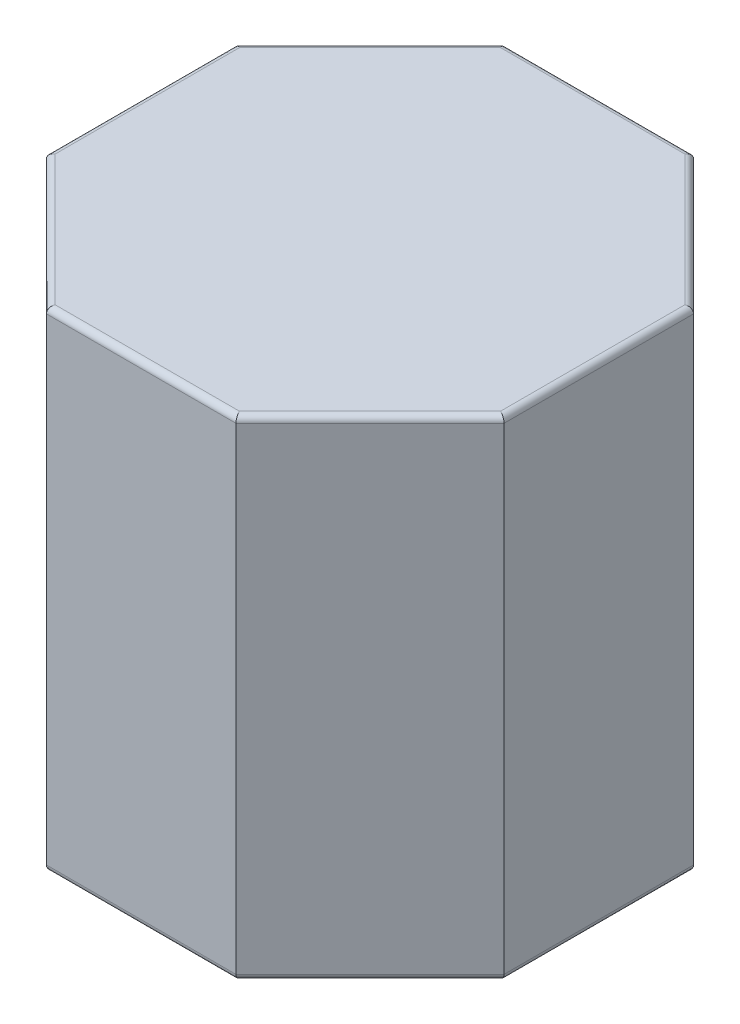
ISO-10303-21;
HEADER;
FILE_DESCRIPTION(('STEP AP214'),'2;1');
FILE_NAME('part.step','',(''),(''),'','','');
FILE_SCHEMA(('AUTOMOTIVE_DESIGN { 1 0 10303 214 1 1 1 1 }'));
ENDSEC;
DATA;
#1=APPLICATION_CONTEXT('core data for automotive mechanical design processes');
#2=APPLICATION_PROTOCOL_DEFINITION('international standard','automotive_design',2000,#1);
#3=PRODUCT_CONTEXT('',#1,'mechanical');
#4=PRODUCT('Part','Part','',(#3));
#5=PRODUCT_RELATED_PRODUCT_CATEGORY('part','',(#4));
#6=PRODUCT_DEFINITION_FORMATION('','',#4);
#7=PRODUCT_DEFINITION_CONTEXT('part definition',#1,'design');
#8=PRODUCT_DEFINITION('design','',#6,#7);
#9=PRODUCT_DEFINITION_SHAPE('','',#8);
#10=(LENGTH_UNIT() NAMED_UNIT(*) SI_UNIT(.MILLI.,.METRE.));
#11=(NAMED_UNIT(*) PLANE_ANGLE_UNIT() SI_UNIT($,.RADIAN.));
#12=(NAMED_UNIT(*) SI_UNIT($,.STERADIAN.) SOLID_ANGLE_UNIT());
#13=UNCERTAINTY_MEASURE_WITH_UNIT(LENGTH_MEASURE(1.E-05),#10,'distance_accuracy_value','');
#14=(GEOMETRIC_REPRESENTATION_CONTEXT(3) GLOBAL_UNCERTAINTY_ASSIGNED_CONTEXT((#13)) GLOBAL_UNIT_ASSIGNED_CONTEXT((#10,
#11,#12)) REPRESENTATION_CONTEXT('',''));
#15=CARTESIAN_POINT('',(0.,0.,0.));
#16=DIRECTION('',(0.,0.,1.));
#17=DIRECTION('',(1.,0.,0.));
#18=AXIS2_PLACEMENT_3D('',#15,#16,#17);
#19=CARTESIAN_POINT('',(-18.69968627595,40.,-7.74644045200017));
#20=DIRECTION('',(0.707106781186547,0.,0.707106781186548));
#21=DIRECTION('',(0.707106781186548,0.,-0.707106781186547));
#22=AXIS2_PLACEMENT_3D('',#19,#20,#21);
#23=PLANE('',#22);
#24=DIRECTION('',(0.,-1.,0.));
#25=VECTOR('',#24,1.);
#26=CARTESIAN_POINT('',(-7.74547989232688,40.,-18.7006468356233));
#27=LINE('',#26,#25);
#28=CARTESIAN_POINT('',(-7.74547989232688,39.5,-18.7006468356233));
#29=VERTEX_POINT('',#28);
#30=CARTESIAN_POINT('',(-7.74547989232688,0.5,-18.7006468356233));
#31=VERTEX_POINT('',#30);
#32=EDGE_CURVE('E241',#29,#31,#27,.T.);
#33=ORIENTED_EDGE('',*,*,#32,.T.);
#34=DIRECTION('',(-0.707106781186548,0.,0.707106781186547));
#35=VECTOR('',#34,1.);
#36=CARTESIAN_POINT('',(-18.69968627595,0.5,-7.74644045200017));
#37=LINE('',#36,#35);
#38=CARTESIAN_POINT('',(-18.69968627595,0.5,-7.74644045200017));
#39=VERTEX_POINT('',#38);
#40=EDGE_CURVE('E178',#31,#39,#37,.T.);
#41=ORIENTED_EDGE('',*,*,#40,.T.);
#42=DIRECTION('',(0.,-1.,0.));
#43=VECTOR('',#42,1.);
#44=CARTESIAN_POINT('',(-18.69968627595,40.,-7.74644045200017));
#45=LINE('',#44,#43);
#46=CARTESIAN_POINT('',(-18.69968627595,39.5,-7.74644045200017));
#47=VERTEX_POINT('',#46);
#48=EDGE_CURVE('E162',#47,#39,#45,.T.);
#49=ORIENTED_EDGE('',*,*,#48,.F.);
#50=DIRECTION('',(-0.707106781186548,0.,0.707106781186547));
#51=VECTOR('',#50,1.);
#52=CARTESIAN_POINT('',(-18.69968627595,39.5,-7.74644045200017));
#53=LINE('',#52,#51);
#54=EDGE_CURVE('E175',#47,#29,#53,.F.);
#55=ORIENTED_EDGE('',*,*,#54,.T.);
#56=EDGE_LOOP('',(#33,#41,#49,#55));
#57=FACE_BOUND('',#56,.T.);
#58=ADVANCED_FACE('F43',(#57),#23,.F.);
#59=CARTESIAN_POINT('',(-18.69968627595,40.,7.74514678075364));
#60=DIRECTION('',(1.,0.,0.));
#61=DIRECTION('',(0.,0.,-1.));
#62=AXIS2_PLACEMENT_3D('',#59,#60,#61);
#63=PLANE('',#62);
#64=ORIENTED_EDGE('',*,*,#48,.T.);
#65=DIRECTION('',(0.,0.,1.));
#66=VECTOR('',#65,1.);
#67=CARTESIAN_POINT('',(-18.69968627595,0.5,7.74514678075364));
#68=LINE('',#67,#66);
#69=CARTESIAN_POINT('',(-18.69968627595,0.5,7.74514678075364));
#70=VERTEX_POINT('',#69);
#71=EDGE_CURVE('E168',#39,#70,#68,.T.);
#72=ORIENTED_EDGE('',*,*,#71,.T.);
#73=DIRECTION('',(0.,-1.,0.));
#74=VECTOR('',#73,1.);
#75=CARTESIAN_POINT('',(-18.69968627595,40.,7.74514678075364));
#76=LINE('',#75,#74);
#77=CARTESIAN_POINT('',(-18.69968627595,39.5,7.74514678075364));
#78=VERTEX_POINT('',#77);
#79=EDGE_CURVE('E164',#78,#70,#76,.T.);
#80=ORIENTED_EDGE('',*,*,#79,.F.);
#81=DIRECTION('',(0.,0.,1.));
#82=VECTOR('',#81,1.);
#83=CARTESIAN_POINT('',(-18.69968627595,39.5,7.74514678075364));
#84=LINE('',#83,#82);
#85=EDGE_CURVE('E159',#78,#47,#84,.F.);
#86=ORIENTED_EDGE('',*,*,#85,.T.);
#87=EDGE_LOOP('',(#64,#72,#80,#86));
#88=FACE_BOUND('',#87,.T.);
#89=ADVANCED_FACE('F161',(#88),#63,.F.);
#90=CARTESIAN_POINT('',(-7.74547989232686,40.,18.6993531643768));
#91=DIRECTION('',(0.707106781186548,0.,-0.707106781186547));
#92=DIRECTION('',(-0.707106781186547,0.,-0.707106781186548));
#93=AXIS2_PLACEMENT_3D('',#90,#91,#92);
#94=PLANE('',#93);
#95=ORIENTED_EDGE('',*,*,#79,.T.);
#96=DIRECTION('',(0.707106781186547,0.,0.707106781186548));
#97=VECTOR('',#96,1.);
#98=CARTESIAN_POINT('',(-7.74547989232686,0.5,18.6993531643768));
#99=LINE('',#98,#97);
#100=CARTESIAN_POINT('',(-7.74547989232686,0.5,18.6993531643768));
#101=VERTEX_POINT('',#100);
#102=EDGE_CURVE('E285',#70,#101,#99,.T.);
#103=ORIENTED_EDGE('',*,*,#102,.T.);
#104=DIRECTION('',(0.,-1.,0.));
#105=VECTOR('',#104,1.);
#106=CARTESIAN_POINT('',(-7.74547989232686,40.,18.6993531643768));
#107=LINE('',#106,#105);
#108=CARTESIAN_POINT('',(-7.74547989232686,39.5,18.6993531643768));
#109=VERTEX_POINT('',#108);
#110=EDGE_CURVE('E261',#109,#101,#107,.T.);
#111=ORIENTED_EDGE('',*,*,#110,.F.);
#112=DIRECTION('',(0.707106781186547,0.,0.707106781186548));
#113=VECTOR('',#112,1.);
#114=CARTESIAN_POINT('',(-7.74547989232686,39.5,18.6993531643768));
#115=LINE('',#114,#113);
#116=EDGE_CURVE('E283',#109,#78,#115,.F.);
#117=ORIENTED_EDGE('',*,*,#116,.T.);
#118=EDGE_LOOP('',(#95,#103,#111,#117));
#119=FACE_BOUND('',#118,.T.);
#120=ADVANCED_FACE('F327',(#119),#94,.F.);
#121=CARTESIAN_POINT('',(7.74610734042694,40.,18.6993531643768));
#122=DIRECTION('',(0.,0.,-1.));
#123=DIRECTION('',(-1.,0.,0.));
#124=AXIS2_PLACEMENT_3D('',#121,#122,#123);
#125=PLANE('',#124);
#126=ORIENTED_EDGE('',*,*,#110,.T.);
#127=DIRECTION('',(1.,0.,0.));
#128=VECTOR('',#127,1.);
#129=CARTESIAN_POINT('',(7.74610734042694,0.5,18.6993531643768));
#130=LINE('',#129,#128);
#131=CARTESIAN_POINT('',(7.74610734042694,0.5,18.6993531643768));
#132=VERTEX_POINT('',#131);
#133=EDGE_CURVE('E289',#101,#132,#130,.T.);
#134=ORIENTED_EDGE('',*,*,#133,.T.);
#135=DIRECTION('',(0.,-1.,0.));
#136=VECTOR('',#135,1.);
#137=CARTESIAN_POINT('',(7.74610734042694,40.,18.6993531643768));
#138=LINE('',#137,#136);
#139=CARTESIAN_POINT('',(7.74610734042694,39.5,18.6993531643768));
#140=VERTEX_POINT('',#139);
#141=EDGE_CURVE('E258',#140,#132,#138,.T.);
#142=ORIENTED_EDGE('',*,*,#141,.F.);
#143=DIRECTION('',(1.,0.,0.));
#144=VECTOR('',#143,1.);
#145=CARTESIAN_POINT('',(7.74610734042694,39.5,18.6993531643768));
#146=LINE('',#145,#144);
#147=EDGE_CURVE('E287',#140,#109,#146,.F.);
#148=ORIENTED_EDGE('',*,*,#147,.T.);
#149=EDGE_LOOP('',(#126,#134,#142,#148));
#150=FACE_BOUND('',#149,.T.);
#151=ADVANCED_FACE('F330',(#150),#125,.F.);
#152=CARTESIAN_POINT('',(18.7003137240501,40.,7.74514678075363));
#153=DIRECTION('',(-0.707106781186548,0.,-0.707106781186547));
#154=DIRECTION('',(-0.707106781186547,0.,0.707106781186548));
#155=AXIS2_PLACEMENT_3D('',#152,#153,#154);
#156=PLANE('',#155);
#157=ORIENTED_EDGE('',*,*,#141,.T.);
#158=DIRECTION('',(0.707106781186547,0.,-0.707106781186548));
#159=VECTOR('',#158,1.);
#160=CARTESIAN_POINT('',(18.7003137240501,0.5,7.74514678075363));
#161=LINE('',#160,#159);
#162=CARTESIAN_POINT('',(18.7003137240501,0.5,7.74514678075363));
#163=VERTEX_POINT('',#162);
#164=EDGE_CURVE('E293',#132,#163,#161,.T.);
#165=ORIENTED_EDGE('',*,*,#164,.T.);
#166=DIRECTION('',(0.,-1.,0.));
#167=VECTOR('',#166,1.);
#168=CARTESIAN_POINT('',(18.7003137240501,40.,7.74514678075363));
#169=LINE('',#168,#167);
#170=CARTESIAN_POINT('',(18.7003137240501,39.5,7.74514678075363));
#171=VERTEX_POINT('',#170);
#172=EDGE_CURVE('E255',#171,#163,#169,.T.);
#173=ORIENTED_EDGE('',*,*,#172,.F.);
#174=DIRECTION('',(0.707106781186547,0.,-0.707106781186548));
#175=VECTOR('',#174,1.);
#176=CARTESIAN_POINT('',(18.7003137240501,39.5,7.74514678075363));
#177=LINE('',#176,#175);
#178=EDGE_CURVE('E291',#171,#140,#177,.F.);
#179=ORIENTED_EDGE('',*,*,#178,.T.);
#180=EDGE_LOOP('',(#157,#165,#173,#179));
#181=FACE_BOUND('',#180,.T.);
#182=ADVANCED_FACE('F347',(#181),#156,.F.);
#183=CARTESIAN_POINT('',(18.7003137240501,40.,-7.74644045200015));
#184=DIRECTION('',(-1.,0.,0.));
#185=DIRECTION('',(0.,0.,1.));
#186=AXIS2_PLACEMENT_3D('',#183,#184,#185);
#187=PLANE('',#186);
#188=ORIENTED_EDGE('',*,*,#172,.T.);
#189=DIRECTION('',(0.,0.,-1.));
#190=VECTOR('',#189,1.);
#191=CARTESIAN_POINT('',(18.7003137240501,0.5,-7.74644045200015));
#192=LINE('',#191,#190);
#193=CARTESIAN_POINT('',(18.7003137240501,0.5,-7.74644045200015));
#194=VERTEX_POINT('',#193);
#195=EDGE_CURVE('E297',#163,#194,#192,.T.);
#196=ORIENTED_EDGE('',*,*,#195,.T.);
#197=DIRECTION('',(0.,-1.,0.));
#198=VECTOR('',#197,1.);
#199=CARTESIAN_POINT('',(18.7003137240501,40.,-7.74644045200015));
#200=LINE('',#199,#198);
#201=CARTESIAN_POINT('',(18.7003137240501,39.5,-7.74644045200015));
#202=VERTEX_POINT('',#201);
#203=EDGE_CURVE('E250',#202,#194,#200,.T.);
#204=ORIENTED_EDGE('',*,*,#203,.F.);
#205=DIRECTION('',(0.,0.,-1.));
#206=VECTOR('',#205,1.);
#207=CARTESIAN_POINT('',(18.7003137240501,39.5,-7.74644045200015));
#208=LINE('',#207,#206);
#209=EDGE_CURVE('E295',#202,#171,#208,.F.);
#210=ORIENTED_EDGE('',*,*,#209,.T.);
#211=EDGE_LOOP('',(#188,#196,#204,#210));
#212=FACE_BOUND('',#211,.T.);
#213=ADVANCED_FACE('F350',(#212),#187,.F.);
#214=CARTESIAN_POINT('',(7.74610734042693,40.,-18.7006468356233));
#215=DIRECTION('',(-0.707106781186547,0.,0.707106781186548));
#216=DIRECTION('',(0.707106781186548,0.,0.707106781186547));
#217=AXIS2_PLACEMENT_3D('',#214,#215,#216);
#218=PLANE('',#217);
#219=ORIENTED_EDGE('',*,*,#203,.T.);
#220=DIRECTION('',(-0.707106781186548,0.,-0.707106781186547));
#221=VECTOR('',#220,1.);
#222=CARTESIAN_POINT('',(7.74610734042693,0.5,-18.7006468356233));
#223=LINE('',#222,#221);
#224=CARTESIAN_POINT('',(7.74610734042693,0.5,-18.7006468356233));
#225=VERTEX_POINT('',#224);
#226=EDGE_CURVE('E301',#194,#225,#223,.T.);
#227=ORIENTED_EDGE('',*,*,#226,.T.);
#228=DIRECTION('',(0.,-1.,0.));
#229=VECTOR('',#228,1.);
#230=CARTESIAN_POINT('',(7.74610734042693,40.,-18.7006468356233));
#231=LINE('',#230,#229);
#232=CARTESIAN_POINT('',(7.74610734042693,39.5,-18.7006468356233));
#233=VERTEX_POINT('',#232);
#234=EDGE_CURVE('E246',#233,#225,#231,.T.);
#235=ORIENTED_EDGE('',*,*,#234,.F.);
#236=DIRECTION('',(-0.707106781186548,0.,-0.707106781186547));
#237=VECTOR('',#236,1.);
#238=CARTESIAN_POINT('',(7.74610734042693,39.5,-18.7006468356233));
#239=LINE('',#238,#237);
#240=EDGE_CURVE('E299',#233,#202,#239,.F.);
#241=ORIENTED_EDGE('',*,*,#240,.T.);
#242=EDGE_LOOP('',(#219,#227,#235,#241));
#243=FACE_BOUND('',#242,.T.);
#244=ADVANCED_FACE('F516',(#243),#218,.F.);
#245=CARTESIAN_POINT('',(-7.74547989232688,40.,-18.7006468356233));
#246=DIRECTION('',(0.,0.,1.));
#247=DIRECTION('',(1.,0.,0.));
#248=AXIS2_PLACEMENT_3D('',#245,#246,#247);
#249=PLANE('',#248);
#250=ORIENTED_EDGE('',*,*,#234,.T.);
#251=DIRECTION('',(-1.,0.,0.));
#252=VECTOR('',#251,1.);
#253=CARTESIAN_POINT('',(-7.74547989232688,0.5,-18.7006468356233));
#254=LINE('',#253,#252);
#255=EDGE_CURVE('E305',#225,#31,#254,.T.);
#256=ORIENTED_EDGE('',*,*,#255,.T.);
#257=ORIENTED_EDGE('',*,*,#32,.F.);
#258=DIRECTION('',(-1.,0.,0.));
#259=VECTOR('',#258,1.);
#260=CARTESIAN_POINT('',(-7.74547989232688,39.5,-18.7006468356233));
#261=LINE('',#260,#259);
#262=EDGE_CURVE('E303',#29,#233,#261,.F.);
#263=ORIENTED_EDGE('',*,*,#262,.T.);
#264=EDGE_LOOP('',(#250,#256,#257,#263));
#265=FACE_BOUND('',#264,.T.);
#266=ADVANCED_FACE('F508',(#265),#249,.F.);
#267=CARTESIAN_POINT('',(0.,40.,0.));
#268=DIRECTION('',(0.,-1.,0.));
#269=DIRECTION('',(0.,0.,-1.));
#270=AXIS2_PLACEMENT_3D('',#267,#268,#269);
#271=PLANE('',#270);
#272=DIRECTION('',(-1.,0.,0.));
#273=VECTOR('',#272,1.);
#274=CARTESIAN_POINT('',(0.,40.,-18.2006468356233));
#275=LINE('',#274,#273);
#276=CARTESIAN_POINT('',(7.53900055924038,40.,-18.2006468356233));
#277=VERTEX_POINT('',#276);
#278=CARTESIAN_POINT('',(-7.53837311114033,40.,-18.2006468356233));
#279=VERTEX_POINT('',#278);
#280=EDGE_CURVE('E307',#277,#279,#275,.T.);
#281=ORIENTED_EDGE('',*,*,#280,.T.);
#282=DIRECTION('',(-0.707106781186548,0.,0.707106781186547));
#283=VECTOR('',#282,1.);
#284=CARTESIAN_POINT('',(-12.8695099733818,40.,-12.8695099733818));
#285=LINE('',#284,#283);
#286=CARTESIAN_POINT('',(-18.19968627595,40.,-7.53933367081362));
#287=VERTEX_POINT('',#286);
#288=EDGE_CURVE('E11',#279,#287,#285,.T.);
#289=ORIENTED_EDGE('',*,*,#288,.T.);
#290=DIRECTION('',(0.,0.,1.));
#291=VECTOR('',#290,1.);
#292=CARTESIAN_POINT('',(-18.19968627595,40.,0.));
#293=LINE('',#292,#291);
#294=CARTESIAN_POINT('',(-18.19968627595,40.,7.53803999956709));
#295=VERTEX_POINT('',#294);
#296=EDGE_CURVE('E52',#287,#295,#293,.T.);
#297=ORIENTED_EDGE('',*,*,#296,.T.);
#298=DIRECTION('',(0.707106781186547,0.,0.707106781186548));
#299=VECTOR('',#298,1.);
#300=CARTESIAN_POINT('',(-12.8688631377586,40.,12.8688631377585));
#301=LINE('',#300,#299);
#302=CARTESIAN_POINT('',(-7.53837311114032,40.,18.1993531643768));
#303=VERTEX_POINT('',#302);
#304=EDGE_CURVE('E317',#295,#303,#301,.T.);
#305=ORIENTED_EDGE('',*,*,#304,.T.);
#306=DIRECTION('',(1.,0.,0.));
#307=VECTOR('',#306,1.);
#308=CARTESIAN_POINT('',(0.,40.,18.1993531643768));
#309=LINE('',#308,#307);
#310=CARTESIAN_POINT('',(7.53900055924039,40.,18.1993531643768));
#311=VERTEX_POINT('',#310);
#312=EDGE_CURVE('E315',#303,#311,#309,.T.);
#313=ORIENTED_EDGE('',*,*,#312,.T.);
#314=DIRECTION('',(0.707106781186547,0.,-0.707106781186548));
#315=VECTOR('',#314,1.);
#316=CARTESIAN_POINT('',(12.8691768618086,40.,12.8691768618086));
#317=LINE('',#316,#315);
#318=CARTESIAN_POINT('',(18.2003137240501,40.,7.53803999956708));
#319=VERTEX_POINT('',#318);
#320=EDGE_CURVE('E313',#311,#319,#317,.T.);
#321=ORIENTED_EDGE('',*,*,#320,.T.);
#322=DIRECTION('',(0.,0.,-1.));
#323=VECTOR('',#322,1.);
#324=CARTESIAN_POINT('',(18.2003137240501,40.,0.));
#325=LINE('',#324,#323);
#326=CARTESIAN_POINT('',(18.2003137240501,40.,-7.53933367081361));
#327=VERTEX_POINT('',#326);
#328=EDGE_CURVE('E311',#319,#327,#325,.T.);
#329=ORIENTED_EDGE('',*,*,#328,.T.);
#330=DIRECTION('',(-0.707106781186548,0.,-0.707106781186547));
#331=VECTOR('',#330,1.);
#332=CARTESIAN_POINT('',(12.8698236974318,40.,-12.8698236974318));
#333=LINE('',#332,#331);
#334=EDGE_CURVE('E309',#327,#277,#333,.T.);
#335=ORIENTED_EDGE('',*,*,#334,.T.);
#336=EDGE_LOOP('',(#281,#289,#297,#305,#313,#321,#329,#335));
#337=FACE_BOUND('',#336,.T.);
#338=ADVANCED_FACE('F318',(#337),#271,.F.);
#339=CARTESIAN_POINT('',(0.,0.,0.));
#340=DIRECTION('',(0.,-1.,0.));
#341=DIRECTION('',(0.,0.,-1.));
#342=AXIS2_PLACEMENT_3D('',#339,#340,#341);
#343=PLANE('',#342);
#344=DIRECTION('',(0.,0.,1.));
#345=VECTOR('',#344,1.);
#346=CARTESIAN_POINT('',(-18.19968627595,0.,-7.74644045200017));
#347=LINE('',#346,#345);
#348=CARTESIAN_POINT('',(-18.19968627595,0.,7.53803999956709));
#349=VERTEX_POINT('',#348);
#350=CARTESIAN_POINT('',(-18.19968627595,0.,-7.53933367081362));
#351=VERTEX_POINT('',#350);
#352=EDGE_CURVE('E278',#349,#351,#347,.F.);
#353=ORIENTED_EDGE('',*,*,#352,.T.);
#354=DIRECTION('',(-0.707106781186548,0.,0.707106781186547));
#355=VECTOR('',#354,1.);
#356=CARTESIAN_POINT('',(-7.3919265017336,0.,-18.34709344503));
#357=LINE('',#356,#355);
#358=CARTESIAN_POINT('',(-7.53837311114033,0.,-18.2006468356233));
#359=VERTEX_POINT('',#358);
#360=EDGE_CURVE('E169',#351,#359,#357,.F.);
#361=ORIENTED_EDGE('',*,*,#360,.T.);
#362=DIRECTION('',(-1.,0.,0.));
#363=VECTOR('',#362,1.);
#364=CARTESIAN_POINT('',(7.74610734042693,0.,-18.2006468356233));
#365=LINE('',#364,#363);
#366=CARTESIAN_POINT('',(7.53900055924038,0.,-18.2006468356233));
#367=VERTEX_POINT('',#366);
#368=EDGE_CURVE('E266',#359,#367,#365,.F.);
#369=ORIENTED_EDGE('',*,*,#368,.T.);
#370=DIRECTION('',(-0.707106781186548,0.,-0.707106781186547));
#371=VECTOR('',#370,1.);
#372=CARTESIAN_POINT('',(18.3467603334568,0.,-7.39288706140688));
#373=LINE('',#372,#371);
#374=CARTESIAN_POINT('',(18.2003137240501,0.,-7.53933367081361));
#375=VERTEX_POINT('',#374);
#376=EDGE_CURVE('E268',#367,#375,#373,.F.);
#377=ORIENTED_EDGE('',*,*,#376,.T.);
#378=DIRECTION('',(0.,0.,-1.));
#379=VECTOR('',#378,1.);
#380=CARTESIAN_POINT('',(18.2003137240501,0.,7.74514678075363));
#381=LINE('',#380,#379);
#382=CARTESIAN_POINT('',(18.2003137240501,0.,7.53803999956708));
#383=VERTEX_POINT('',#382);
#384=EDGE_CURVE('E270',#375,#383,#381,.F.);
#385=ORIENTED_EDGE('',*,*,#384,.T.);
#386=DIRECTION('',(0.707106781186547,0.,-0.707106781186548));
#387=VECTOR('',#386,1.);
#388=CARTESIAN_POINT('',(7.39255394983366,0.,18.3457997737835));
#389=LINE('',#388,#387);
#390=CARTESIAN_POINT('',(7.53900055924039,0.,18.1993531643768));
#391=VERTEX_POINT('',#390);
#392=EDGE_CURVE('E272',#383,#391,#389,.F.);
#393=ORIENTED_EDGE('',*,*,#392,.T.);
#394=DIRECTION('',(1.,0.,0.));
#395=VECTOR('',#394,1.);
#396=CARTESIAN_POINT('',(-7.74547989232686,0.,18.1993531643768));
#397=LINE('',#396,#395);
#398=CARTESIAN_POINT('',(-7.53837311114032,0.,18.1993531643768));
#399=VERTEX_POINT('',#398);
#400=EDGE_CURVE('E274',#391,#399,#397,.F.);
#401=ORIENTED_EDGE('',*,*,#400,.T.);
#402=DIRECTION('',(0.707106781186547,0.,0.707106781186548));
#403=VECTOR('',#402,1.);
#404=CARTESIAN_POINT('',(-18.3461328853567,0.,7.39159339016037));
#405=LINE('',#404,#403);
#406=EDGE_CURVE('E276',#399,#349,#405,.F.);
#407=ORIENTED_EDGE('',*,*,#406,.T.);
#408=EDGE_LOOP('',(#353,#361,#369,#377,#385,#393,#401,#407));
#409=FACE_BOUND('',#408,.T.);
#410=ADVANCED_FACE('F340',(#409),#343,.T.);
#411=CARTESIAN_POINT('',(18.3467603334568,0.5,7.39159339016035));
#412=DIRECTION('',(-0.707106781186547,0.,0.707106781186548));
#413=DIRECTION('',(0.707106781186548,0.,0.707106781186547));
#414=AXIS2_PLACEMENT_3D('',#411,#412,#413);
#415=CYLINDRICAL_SURFACE('',#414,0.5);
#416=CARTESIAN_POINT('',(7.53900055924039,0.5,18.1993531643768));
#417=DIRECTION('',(-0.923879532511287,0.,0.382683432365091));
#418=DIRECTION('',(0.38268343236509,0.,0.923879532511287));
#419=AXIS2_PLACEMENT_3D('',#416,#417,#418);
#420=ELLIPSE('',#419,0.541196100146197,0.5);
#421=EDGE_CURVE('E234',#391,#132,#420,.T.);
#422=ORIENTED_EDGE('',*,*,#421,.F.);
#423=ORIENTED_EDGE('',*,*,#392,.F.);
#424=CARTESIAN_POINT('',(18.2003137240501,0.5,7.53803999956708));
#425=DIRECTION('',(-0.38268343236509,0.,0.923879532511287));
#426=DIRECTION('',(0.923879532511287,0.,0.38268343236509));
#427=AXIS2_PLACEMENT_3D('',#424,#425,#426);
#428=ELLIPSE('',#427,0.541196100146197,0.5);
#429=EDGE_CURVE('E190',#163,#383,#428,.F.);
#430=ORIENTED_EDGE('',*,*,#429,.F.);
#431=ORIENTED_EDGE('',*,*,#164,.F.);
#432=EDGE_LOOP('',(#422,#423,#430,#431));
#433=FACE_BOUND('',#432,.T.);
#434=ADVANCED_FACE('F344',(#433),#415,.T.);
#435=CARTESIAN_POINT('',(18.2003137240501,0.5,-7.74644045200015));
#436=DIRECTION('',(0.,0.,1.));
#437=DIRECTION('',(1.,0.,0.));
#438=AXIS2_PLACEMENT_3D('',#435,#436,#437);
#439=CYLINDRICAL_SURFACE('',#438,0.5);
#440=ORIENTED_EDGE('',*,*,#429,.T.);
#441=ORIENTED_EDGE('',*,*,#384,.F.);
#442=CARTESIAN_POINT('',(18.2003137240501,0.5,-7.53933367081361));
#443=DIRECTION('',(0.38268343236509,0.,0.923879532511287));
#444=DIRECTION('',(0.923879532511287,0.,-0.38268343236509));
#445=AXIS2_PLACEMENT_3D('',#442,#443,#444);
#446=ELLIPSE('',#445,0.541196100146197,0.5);
#447=EDGE_CURVE('E232',#194,#375,#446,.F.);
#448=ORIENTED_EDGE('',*,*,#447,.F.);
#449=ORIENTED_EDGE('',*,*,#195,.F.);
#450=EDGE_LOOP('',(#440,#441,#448,#449));
#451=FACE_BOUND('',#450,.T.);
#452=ADVANCED_FACE('F392',(#451),#439,.T.);
#453=CARTESIAN_POINT('',(7.74610734042694,0.5,18.1993531643768));
#454=DIRECTION('',(-1.,0.,0.));
#455=DIRECTION('',(0.,0.,1.));
#456=AXIS2_PLACEMENT_3D('',#453,#454,#455);
#457=CYLINDRICAL_SURFACE('',#456,0.5);
#458=ORIENTED_EDGE('',*,*,#421,.T.);
#459=ORIENTED_EDGE('',*,*,#133,.F.);
#460=CARTESIAN_POINT('',(-7.53837311114031,0.5,18.1993531643768));
#461=DIRECTION('',(-0.923879532511287,0.,-0.38268343236509));
#462=DIRECTION('',(-0.38268343236509,0.,0.923879532511287));
#463=AXIS2_PLACEMENT_3D('',#460,#461,#462);
#464=ELLIPSE('',#463,0.541196100146197,0.5);
#465=EDGE_CURVE('E229',#399,#101,#464,.T.);
#466=ORIENTED_EDGE('',*,*,#465,.F.);
#467=ORIENTED_EDGE('',*,*,#400,.F.);
#468=EDGE_LOOP('',(#458,#459,#466,#467));
#469=FACE_BOUND('',#468,.T.);
#470=ADVANCED_FACE('F333',(#469),#457,.T.);
#471=CARTESIAN_POINT('',(7.39255394983365,0.5,-18.34709344503));
#472=DIRECTION('',(0.707106781186548,0.,0.707106781186547));
#473=DIRECTION('',(0.707106781186547,0.,-0.707106781186548));
#474=AXIS2_PLACEMENT_3D('',#471,#472,#473);
#475=CYLINDRICAL_SURFACE('',#474,0.5);
#476=ORIENTED_EDGE('',*,*,#447,.T.);
#477=ORIENTED_EDGE('',*,*,#376,.F.);
#478=CARTESIAN_POINT('',(7.53900055924038,0.5,-18.2006468356233));
#479=DIRECTION('',(0.923879532511287,0.,0.382683432365089));
#480=DIRECTION('',(0.382683432365089,0.,-0.923879532511287));
#481=AXIS2_PLACEMENT_3D('',#478,#479,#480);
#482=ELLIPSE('',#481,0.541196100146197,0.5);
#483=EDGE_CURVE('E226',#225,#367,#482,.F.);
#484=ORIENTED_EDGE('',*,*,#483,.F.);
#485=ORIENTED_EDGE('',*,*,#226,.F.);
#486=EDGE_LOOP('',(#476,#477,#484,#485));
#487=FACE_BOUND('',#486,.T.);
#488=ADVANCED_FACE('F386',(#487),#475,.T.);
#489=CARTESIAN_POINT('',(-7.39192650173359,0.5,18.3457997737835));
#490=DIRECTION('',(-0.707106781186547,0.,-0.707106781186548));
#491=DIRECTION('',(-0.707106781186548,0.,0.707106781186547));
#492=AXIS2_PLACEMENT_3D('',#489,#490,#491);
#493=CYLINDRICAL_SURFACE('',#492,0.5);
#494=ORIENTED_EDGE('',*,*,#465,.T.);
#495=ORIENTED_EDGE('',*,*,#102,.F.);
#496=CARTESIAN_POINT('',(-18.19968627595,0.5,7.53803999956709));
#497=DIRECTION('',(-0.38268343236509,0.,-0.923879532511287));
#498=DIRECTION('',(-0.923879532511287,0.,0.38268343236509));
#499=AXIS2_PLACEMENT_3D('',#496,#497,#498);
#500=ELLIPSE('',#499,0.541196100146197,0.5);
#501=EDGE_CURVE('E220',#349,#70,#500,.T.);
#502=ORIENTED_EDGE('',*,*,#501,.F.);
#503=ORIENTED_EDGE('',*,*,#406,.F.);
#504=EDGE_LOOP('',(#494,#495,#502,#503));
#505=FACE_BOUND('',#504,.T.);
#506=ADVANCED_FACE('F336',(#505),#493,.T.);
#507=CARTESIAN_POINT('',(-7.74547989232688,0.5,-18.2006468356233));
#508=DIRECTION('',(1.,0.,0.));
#509=DIRECTION('',(0.,0.,-1.));
#510=AXIS2_PLACEMENT_3D('',#507,#508,#509);
#511=CYLINDRICAL_SURFACE('',#510,0.5);
#512=ORIENTED_EDGE('',*,*,#483,.T.);
#513=ORIENTED_EDGE('',*,*,#368,.F.);
#514=CARTESIAN_POINT('',(-7.53837311114033,0.5,-18.2006468356233));
#515=DIRECTION('',(0.923879532511287,0.,-0.38268343236509));
#516=DIRECTION('',(0.38268343236509,0.,0.923879532511287));
#517=AXIS2_PLACEMENT_3D('',#514,#515,#516);
#518=ELLIPSE('',#517,0.541196100146197,0.5);
#519=EDGE_CURVE('E214',#31,#359,#518,.F.);
#520=ORIENTED_EDGE('',*,*,#519,.F.);
#521=ORIENTED_EDGE('',*,*,#255,.F.);
#522=EDGE_LOOP('',(#512,#513,#520,#521));
#523=FACE_BOUND('',#522,.T.);
#524=ADVANCED_FACE('F379',(#523),#511,.T.);
#525=CARTESIAN_POINT('',(-18.19968627595,0.5,7.74514678075364));
#526=DIRECTION('',(0.,0.,-1.));
#527=DIRECTION('',(-1.,0.,0.));
#528=AXIS2_PLACEMENT_3D('',#525,#526,#527);
#529=CYLINDRICAL_SURFACE('',#528,0.5);
#530=ORIENTED_EDGE('',*,*,#501,.T.);
#531=ORIENTED_EDGE('',*,*,#71,.F.);
#532=CARTESIAN_POINT('',(-18.19968627595,0.5,-7.53933367081362));
#533=DIRECTION('',(0.38268343236509,0.,-0.923879532511287));
#534=DIRECTION('',(-0.923879532511287,0.,-0.38268343236509));
#535=AXIS2_PLACEMENT_3D('',#532,#533,#534);
#536=ELLIPSE('',#535,0.541196100146197,0.5);
#537=EDGE_CURVE('E209',#351,#39,#536,.T.);
#538=ORIENTED_EDGE('',*,*,#537,.F.);
#539=ORIENTED_EDGE('',*,*,#352,.F.);
#540=EDGE_LOOP('',(#530,#531,#538,#539));
#541=FACE_BOUND('',#540,.T.);
#542=ADVANCED_FACE('F367',(#541),#529,.T.);
#543=CARTESIAN_POINT('',(-18.3461328853567,0.5,-7.39288706140689));
#544=DIRECTION('',(0.707106781186548,0.,-0.707106781186547));
#545=DIRECTION('',(-0.707106781186547,0.,-0.707106781186548));
#546=AXIS2_PLACEMENT_3D('',#543,#544,#545);
#547=CYLINDRICAL_SURFACE('',#546,0.5);
#548=ORIENTED_EDGE('',*,*,#519,.T.);
#549=ORIENTED_EDGE('',*,*,#360,.F.);
#550=ORIENTED_EDGE('',*,*,#537,.T.);
#551=ORIENTED_EDGE('',*,*,#40,.F.);
#552=EDGE_LOOP('',(#548,#549,#550,#551));
#553=FACE_BOUND('',#552,.T.);
#554=ADVANCED_FACE('F362',(#553),#547,.T.);
#555=CARTESIAN_POINT('',(12.8691768618086,39.5,12.8691768618086));
#556=DIRECTION('',(0.707106781186547,0.,-0.707106781186548));
#557=DIRECTION('',(-0.707106781186548,0.,-0.707106781186547));
#558=AXIS2_PLACEMENT_3D('',#555,#556,#557);
#559=CYLINDRICAL_SURFACE('',#558,0.5);
#560=CARTESIAN_POINT('',(7.53900055924039,39.5,18.1993531643768));
#561=DIRECTION('',(0.923879532511287,0.,-0.382683432365091));
#562=DIRECTION('',(-0.38268343236509,0.,-0.923879532511287));
#563=AXIS2_PLACEMENT_3D('',#560,#561,#562);
#564=ELLIPSE('',#563,0.541196100146197,0.5);
#565=EDGE_CURVE('E202',#140,#311,#564,.F.);
#566=ORIENTED_EDGE('',*,*,#565,.F.);
#567=ORIENTED_EDGE('',*,*,#178,.F.);
#568=CARTESIAN_POINT('',(18.2003137240501,39.5,7.53803999956708));
#569=DIRECTION('',(0.38268343236509,0.,-0.923879532511287));
#570=DIRECTION('',(-0.923879532511287,0.,-0.38268343236509));
#571=AXIS2_PLACEMENT_3D('',#568,#569,#570);
#572=ELLIPSE('',#571,0.541196100146197,0.5);
#573=EDGE_CURVE('E47',#319,#171,#572,.T.);
#574=ORIENTED_EDGE('',*,*,#573,.F.);
#575=ORIENTED_EDGE('',*,*,#320,.F.);
#576=EDGE_LOOP('',(#566,#567,#574,#575));
#577=FACE_BOUND('',#576,.T.);
#578=ADVANCED_FACE('F45',(#577),#559,.T.);
#579=CARTESIAN_POINT('',(18.2003137240501,39.5,0.));
#580=DIRECTION('',(0.,0.,-1.));
#581=DIRECTION('',(-1.,0.,0.));
#582=AXIS2_PLACEMENT_3D('',#579,#580,#581);
#583=CYLINDRICAL_SURFACE('',#582,0.5);
#584=ORIENTED_EDGE('',*,*,#573,.T.);
#585=ORIENTED_EDGE('',*,*,#209,.F.);
#586=CARTESIAN_POINT('',(18.2003137240501,39.5,-7.53933367081361));
#587=DIRECTION('',(-0.38268343236509,0.,-0.923879532511287));
#588=DIRECTION('',(-0.923879532511287,0.,0.38268343236509));
#589=AXIS2_PLACEMENT_3D('',#586,#587,#588);
#590=ELLIPSE('',#589,0.541196100146197,0.5);
#591=EDGE_CURVE('E200',#327,#202,#590,.T.);
#592=ORIENTED_EDGE('',*,*,#591,.F.);
#593=ORIENTED_EDGE('',*,*,#328,.F.);
#594=EDGE_LOOP('',(#584,#585,#592,#593));
#595=FACE_BOUND('',#594,.T.);
#596=ADVANCED_FACE('F353',(#595),#583,.T.);
#597=CARTESIAN_POINT('',(0.,39.5,18.1993531643768));
#598=DIRECTION('',(1.,0.,0.));
#599=DIRECTION('',(0.,0.,-1.));
#600=AXIS2_PLACEMENT_3D('',#597,#598,#599);
#601=CYLINDRICAL_SURFACE('',#600,0.5);
#602=ORIENTED_EDGE('',*,*,#565,.T.);
#603=ORIENTED_EDGE('',*,*,#312,.F.);
#604=CARTESIAN_POINT('',(-7.53837311114031,39.5,18.1993531643768));
#605=DIRECTION('',(0.923879532511287,0.,0.38268343236509));
#606=DIRECTION('',(0.38268343236509,0.,-0.923879532511287));
#607=AXIS2_PLACEMENT_3D('',#604,#605,#606);
#608=ELLIPSE('',#607,0.541196100146197,0.5);
#609=EDGE_CURVE('E197',#109,#303,#608,.F.);
#610=ORIENTED_EDGE('',*,*,#609,.F.);
#611=ORIENTED_EDGE('',*,*,#147,.F.);
#612=EDGE_LOOP('',(#602,#603,#610,#611));
#613=FACE_BOUND('',#612,.T.);
#614=ADVANCED_FACE('F322',(#613),#601,.T.);
#615=CARTESIAN_POINT('',(12.8698236974318,39.5,-12.8698236974318));
#616=DIRECTION('',(-0.707106781186548,0.,-0.707106781186547));
#617=DIRECTION('',(-0.707106781186547,0.,0.707106781186548));
#618=AXIS2_PLACEMENT_3D('',#615,#616,#617);
#619=CYLINDRICAL_SURFACE('',#618,0.5);
#620=ORIENTED_EDGE('',*,*,#591,.T.);
#621=ORIENTED_EDGE('',*,*,#240,.F.);
#622=CARTESIAN_POINT('',(7.53900055924038,39.5,-18.2006468356233));
#623=DIRECTION('',(-0.923879532511287,0.,-0.382683432365089));
#624=DIRECTION('',(-0.382683432365089,0.,0.923879532511287));
#625=AXIS2_PLACEMENT_3D('',#622,#623,#624);
#626=ELLIPSE('',#625,0.541196100146197,0.5);
#627=EDGE_CURVE('E194',#277,#233,#626,.T.);
#628=ORIENTED_EDGE('',*,*,#627,.F.);
#629=ORIENTED_EDGE('',*,*,#334,.F.);
#630=EDGE_LOOP('',(#620,#621,#628,#629));
#631=FACE_BOUND('',#630,.T.);
#632=ADVANCED_FACE('F357',(#631),#619,.T.);
#633=CARTESIAN_POINT('',(-12.8688631377586,39.5,12.8688631377585));
#634=DIRECTION('',(0.707106781186547,0.,0.707106781186548));
#635=DIRECTION('',(0.707106781186548,0.,-0.707106781186547));
#636=AXIS2_PLACEMENT_3D('',#633,#634,#635);
#637=CYLINDRICAL_SURFACE('',#636,0.5);
#638=ORIENTED_EDGE('',*,*,#609,.T.);
#639=ORIENTED_EDGE('',*,*,#304,.F.);
#640=CARTESIAN_POINT('',(-18.19968627595,39.5,7.53803999956709));
#641=DIRECTION('',(0.38268343236509,0.,0.923879532511287));
#642=DIRECTION('',(0.923879532511287,0.,-0.38268343236509));
#643=AXIS2_PLACEMENT_3D('',#640,#641,#642);
#644=ELLIPSE('',#643,0.541196100146197,0.5);
#645=EDGE_CURVE('E187',#78,#295,#644,.F.);
#646=ORIENTED_EDGE('',*,*,#645,.F.);
#647=ORIENTED_EDGE('',*,*,#116,.F.);
#648=EDGE_LOOP('',(#638,#639,#646,#647));
#649=FACE_BOUND('',#648,.T.);
#650=ADVANCED_FACE('F324',(#649),#637,.T.);
#651=CARTESIAN_POINT('',(0.,39.5,-18.2006468356233));
#652=DIRECTION('',(-1.,0.,0.));
#653=DIRECTION('',(0.,0.,1.));
#654=AXIS2_PLACEMENT_3D('',#651,#652,#653);
#655=CYLINDRICAL_SURFACE('',#654,0.5);
#656=ORIENTED_EDGE('',*,*,#627,.T.);
#657=ORIENTED_EDGE('',*,*,#262,.F.);
#658=CARTESIAN_POINT('',(-7.53837311114032,39.5,-18.2006468356233));
#659=DIRECTION('',(-0.923879532511287,0.,0.38268343236509));
#660=DIRECTION('',(-0.38268343236509,0.,-0.923879532511287));
#661=AXIS2_PLACEMENT_3D('',#658,#659,#660);
#662=ELLIPSE('',#661,0.541196100146197,0.5);
#663=EDGE_CURVE('E182',#279,#29,#662,.T.);
#664=ORIENTED_EDGE('',*,*,#663,.F.);
#665=ORIENTED_EDGE('',*,*,#280,.F.);
#666=EDGE_LOOP('',(#656,#657,#664,#665));
#667=FACE_BOUND('',#666,.T.);
#668=ADVANCED_FACE('F401',(#667),#655,.T.);
#669=CARTESIAN_POINT('',(-18.19968627595,39.5,0.));
#670=DIRECTION('',(0.,0.,1.));
#671=DIRECTION('',(1.,0.,0.));
#672=AXIS2_PLACEMENT_3D('',#669,#670,#671);
#673=CYLINDRICAL_SURFACE('',#672,0.5);
#674=ORIENTED_EDGE('',*,*,#645,.T.);
#675=ORIENTED_EDGE('',*,*,#296,.F.);
#676=CARTESIAN_POINT('',(-18.19968627595,39.5,-7.53933367081362));
#677=DIRECTION('',(-0.38268343236509,0.,0.923879532511287));
#678=DIRECTION('',(0.923879532511287,0.,0.38268343236509));
#679=AXIS2_PLACEMENT_3D('',#676,#677,#678);
#680=ELLIPSE('',#679,0.541196100146197,0.5);
#681=EDGE_CURVE('E60',#47,#287,#680,.F.);
#682=ORIENTED_EDGE('',*,*,#681,.F.);
#683=ORIENTED_EDGE('',*,*,#85,.F.);
#684=EDGE_LOOP('',(#674,#675,#682,#683));
#685=FACE_BOUND('',#684,.T.);
#686=ADVANCED_FACE('F185',(#685),#673,.T.);
#687=CARTESIAN_POINT('',(-12.8695099733818,39.5,-12.8695099733818));
#688=DIRECTION('',(-0.707106781186548,0.,0.707106781186547));
#689=DIRECTION('',(0.707106781186547,0.,0.707106781186548));
#690=AXIS2_PLACEMENT_3D('',#687,#688,#689);
#691=CYLINDRICAL_SURFACE('',#690,0.5);
#692=ORIENTED_EDGE('',*,*,#663,.T.);
#693=ORIENTED_EDGE('',*,*,#54,.F.);
#694=ORIENTED_EDGE('',*,*,#681,.T.);
#695=ORIENTED_EDGE('',*,*,#288,.F.);
#696=EDGE_LOOP('',(#692,#693,#694,#695));
#697=FACE_BOUND('',#696,.T.);
#698=ADVANCED_FACE('F180',(#697),#691,.T.);
#699=CLOSED_SHELL('',(#58,#89,#120,#151,#182,#213,#244,#266,#338,#410,#434,#452,#470,#488,#506,
#524,#542,#554,#578,#596,#614,#632,#650,#668,#686,#698));
#700=MANIFOLD_SOLID_BREP('B2',#699);
#701=ADVANCED_BREP_SHAPE_REPRESENTATION('',(#18,#700),#14);
#702=SHAPE_DEFINITION_REPRESENTATION(#9,#701);
ENDSEC;
END-ISO-10303-21;
